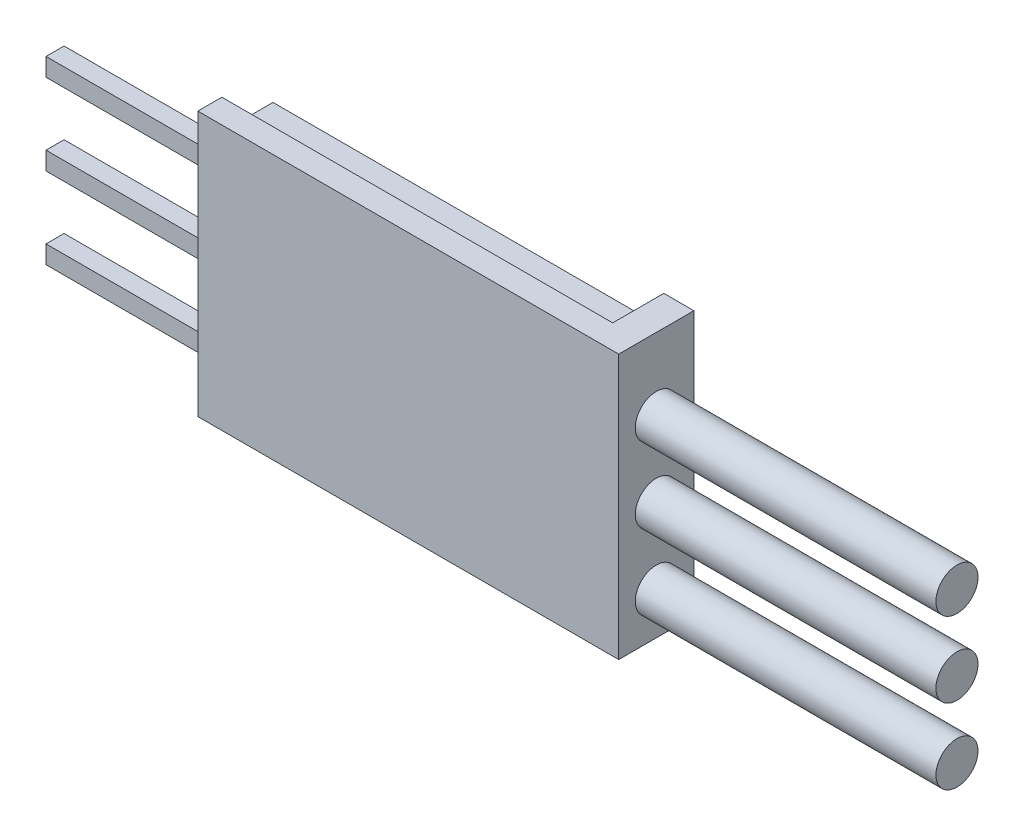
ISO-10303-21;
HEADER;
FILE_DESCRIPTION(('STEP AP214'),'2;1');
FILE_NAME('part.step','',(''),(''),'','','');
FILE_SCHEMA(('AUTOMOTIVE_DESIGN { 1 0 10303 214 1 1 1 1 }'));
ENDSEC;
DATA;
#1=APPLICATION_CONTEXT('core data for automotive mechanical design processes');
#2=APPLICATION_PROTOCOL_DEFINITION('international standard','automotive_design',2000,#1);
#3=PRODUCT_CONTEXT('',#1,'mechanical');
#4=PRODUCT('Part','Part','',(#3));
#5=PRODUCT_RELATED_PRODUCT_CATEGORY('part','',(#4));
#6=PRODUCT_DEFINITION_FORMATION('','',#4);
#7=PRODUCT_DEFINITION_CONTEXT('part definition',#1,'design');
#8=PRODUCT_DEFINITION('design','',#6,#7);
#9=PRODUCT_DEFINITION_SHAPE('','',#8);
#10=(LENGTH_UNIT() NAMED_UNIT(*) SI_UNIT(.MILLI.,.METRE.));
#11=(NAMED_UNIT(*) PLANE_ANGLE_UNIT() SI_UNIT($,.RADIAN.));
#12=(NAMED_UNIT(*) SI_UNIT($,.STERADIAN.) SOLID_ANGLE_UNIT());
#13=UNCERTAINTY_MEASURE_WITH_UNIT(LENGTH_MEASURE(1.E-05),#10,'distance_accuracy_value','');
#14=(GEOMETRIC_REPRESENTATION_CONTEXT(3) GLOBAL_UNCERTAINTY_ASSIGNED_CONTEXT((#13)) GLOBAL_UNIT_ASSIGNED_CONTEXT((#10,
#11,#12)) REPRESENTATION_CONTEXT('',''));
#15=CARTESIAN_POINT('',(0.,0.,0.));
#16=DIRECTION('',(0.,0.,1.));
#17=DIRECTION('',(1.,0.,0.));
#18=AXIS2_PLACEMENT_3D('',#15,#16,#17);
#19=CARTESIAN_POINT('',(-7.,-3.,-0.3));
#20=DIRECTION('',(0.,-1.,0.));
#21=DIRECTION('',(0.,0.,-1.));
#22=AXIS2_PLACEMENT_3D('',#19,#20,#21);
#23=PLANE('',#22);
#24=DIRECTION('',(1.,0.,0.));
#25=VECTOR('',#24,1.);
#26=CARTESIAN_POINT('',(-7.,-3.,0.3));
#27=LINE('',#26,#25);
#28=CARTESIAN_POINT('',(-13.,-3.,0.3));
#29=VERTEX_POINT('',#28);
#30=CARTESIAN_POINT('',(-7.,-3.,0.3));
#31=VERTEX_POINT('',#30);
#32=EDGE_CURVE('E151',#29,#31,#27,.T.);
#33=ORIENTED_EDGE('',*,*,#32,.F.);
#34=DIRECTION('',(0.,0.,-1.));
#35=VECTOR('',#34,1.);
#36=CARTESIAN_POINT('',(-13.,-3.,-0.3));
#37=LINE('',#36,#35);
#38=CARTESIAN_POINT('',(-13.,-3.,-0.3));
#39=VERTEX_POINT('',#38);
#40=EDGE_CURVE('E156',#29,#39,#37,.T.);
#41=ORIENTED_EDGE('',*,*,#40,.T.);
#42=DIRECTION('',(-1.,0.,0.));
#43=VECTOR('',#42,1.);
#44=CARTESIAN_POINT('',(-7.,-3.,-0.3));
#45=LINE('',#44,#43);
#46=CARTESIAN_POINT('',(-7.,-3.,-0.3));
#47=VERTEX_POINT('',#46);
#48=EDGE_CURVE('E154',#47,#39,#45,.T.);
#49=ORIENTED_EDGE('',*,*,#48,.F.);
#50=DIRECTION('',(0.,0.,-1.));
#51=VECTOR('',#50,1.);
#52=CARTESIAN_POINT('',(-7.,-3.,-0.3));
#53=LINE('',#52,#51);
#54=EDGE_CURVE('E146',#47,#31,#53,.F.);
#55=ORIENTED_EDGE('',*,*,#54,.T.);
#56=EDGE_LOOP('',(#33,#41,#49,#55));
#57=FACE_BOUND('',#56,.T.);
#58=ADVANCED_FACE('F17',(#57),#23,.T.);
#59=CARTESIAN_POINT('',(-7.,0.3,-0.3));
#60=DIRECTION('',(0.,0.,-1.));
#61=DIRECTION('',(-1.,0.,0.));
#62=AXIS2_PLACEMENT_3D('',#59,#60,#61);
#63=PLANE('',#62);
#64=DIRECTION('',(1.,0.,0.));
#65=VECTOR('',#64,1.);
#66=CARTESIAN_POINT('',(-7.,-0.3,-0.3));
#67=LINE('',#66,#65);
#68=CARTESIAN_POINT('',(-13.,-0.3,-0.3));
#69=VERTEX_POINT('',#68);
#70=CARTESIAN_POINT('',(-7.,-0.3,-0.3));
#71=VERTEX_POINT('',#70);
#72=EDGE_CURVE('E277',#69,#71,#67,.T.);
#73=ORIENTED_EDGE('',*,*,#72,.F.);
#74=DIRECTION('',(0.,1.,0.));
#75=VECTOR('',#74,1.);
#76=CARTESIAN_POINT('',(-13.,0.3,-0.3));
#77=LINE('',#76,#75);
#78=CARTESIAN_POINT('',(-13.,0.3,-0.3));
#79=VERTEX_POINT('',#78);
#80=EDGE_CURVE('E177',#69,#79,#77,.T.);
#81=ORIENTED_EDGE('',*,*,#80,.T.);
#82=DIRECTION('',(1.,0.,0.));
#83=VECTOR('',#82,1.);
#84=CARTESIAN_POINT('',(-7.,0.3,-0.3));
#85=LINE('',#84,#83);
#86=CARTESIAN_POINT('',(-7.,0.3,-0.3));
#87=VERTEX_POINT('',#86);
#88=EDGE_CURVE('E269',#87,#79,#85,.F.);
#89=ORIENTED_EDGE('',*,*,#88,.F.);
#90=DIRECTION('',(0.,1.,0.));
#91=VECTOR('',#90,1.);
#92=CARTESIAN_POINT('',(-7.,0.3,-0.3));
#93=LINE('',#92,#91);
#94=EDGE_CURVE('E179',#87,#71,#93,.F.);
#95=ORIENTED_EDGE('',*,*,#94,.T.);
#96=EDGE_LOOP('',(#73,#81,#89,#95));
#97=FACE_BOUND('',#96,.T.);
#98=ADVANCED_FACE('F560',(#97),#63,.T.);
#99=CARTESIAN_POINT('',(-7.,3.,-0.3));
#100=DIRECTION('',(0.,0.,-1.));
#101=DIRECTION('',(-1.,0.,0.));
#102=AXIS2_PLACEMENT_3D('',#99,#100,#101);
#103=PLANE('',#102);
#104=DIRECTION('',(1.,0.,0.));
#105=VECTOR('',#104,1.);
#106=CARTESIAN_POINT('',(-7.,2.4,-0.3));
#107=LINE('',#106,#105);
#108=CARTESIAN_POINT('',(-13.,2.4,-0.3));
#109=VERTEX_POINT('',#108);
#110=CARTESIAN_POINT('',(-7.,2.4,-0.3));
#111=VERTEX_POINT('',#110);
#112=EDGE_CURVE('E260',#109,#111,#107,.T.);
#113=ORIENTED_EDGE('',*,*,#112,.F.);
#114=DIRECTION('',(0.,1.,0.));
#115=VECTOR('',#114,1.);
#116=CARTESIAN_POINT('',(-13.,3.,-0.3));
#117=LINE('',#116,#115);
#118=CARTESIAN_POINT('',(-13.,3.,-0.3));
#119=VERTEX_POINT('',#118);
#120=EDGE_CURVE('E170',#109,#119,#117,.T.);
#121=ORIENTED_EDGE('',*,*,#120,.T.);
#122=DIRECTION('',(1.,0.,0.));
#123=VECTOR('',#122,1.);
#124=CARTESIAN_POINT('',(-7.,3.,-0.3));
#125=LINE('',#124,#123);
#126=CARTESIAN_POINT('',(-7.,3.,-0.3));
#127=VERTEX_POINT('',#126);
#128=EDGE_CURVE('E252',#127,#119,#125,.F.);
#129=ORIENTED_EDGE('',*,*,#128,.F.);
#130=DIRECTION('',(0.,1.,0.));
#131=VECTOR('',#130,1.);
#132=CARTESIAN_POINT('',(-7.,3.,-0.3));
#133=LINE('',#132,#131);
#134=EDGE_CURVE('E172',#127,#111,#133,.F.);
#135=ORIENTED_EDGE('',*,*,#134,.T.);
#136=EDGE_LOOP('',(#113,#121,#129,#135));
#137=FACE_BOUND('',#136,.T.);
#138=ADVANCED_FACE('F553',(#137),#103,.T.);
#139=CARTESIAN_POINT('',(-7.,-3.,0.3));
#140=DIRECTION('',(0.,0.,1.));
#141=DIRECTION('',(1.,0.,0.));
#142=AXIS2_PLACEMENT_3D('',#139,#140,#141);
#143=PLANE('',#142);
#144=DIRECTION('',(1.,0.,0.));
#145=VECTOR('',#144,1.);
#146=CARTESIAN_POINT('',(-7.,-2.4,0.3));
#147=LINE('',#146,#145);
#148=CARTESIAN_POINT('',(-13.,-2.4,0.3));
#149=VERTEX_POINT('',#148);
#150=CARTESIAN_POINT('',(-7.,-2.4,0.3));
#151=VERTEX_POINT('',#150);
#152=EDGE_CURVE('E232',#149,#151,#147,.T.);
#153=ORIENTED_EDGE('',*,*,#152,.F.);
#154=DIRECTION('',(0.,1.,0.));
#155=VECTOR('',#154,1.);
#156=CARTESIAN_POINT('',(-13.,0.,0.3));
#157=LINE('',#156,#155);
#158=EDGE_CURVE('E169',#29,#149,#157,.T.);
#159=ORIENTED_EDGE('',*,*,#158,.F.);
#160=ORIENTED_EDGE('',*,*,#32,.T.);
#161=DIRECTION('',(0.,1.,0.));
#162=VECTOR('',#161,1.);
#163=CARTESIAN_POINT('',(-7.,-3.,0.3));
#164=LINE('',#163,#162);
#165=EDGE_CURVE('E159',#31,#151,#164,.T.);
#166=ORIENTED_EDGE('',*,*,#165,.T.);
#167=EDGE_LOOP('',(#153,#159,#160,#166));
#168=FACE_BOUND('',#167,.T.);
#169=ADVANCED_FACE('F167',(#168),#143,.T.);
#170=CARTESIAN_POINT('',(-7.,-2.4,-0.3));
#171=DIRECTION('',(0.,0.,-1.));
#172=DIRECTION('',(-1.,0.,0.));
#173=AXIS2_PLACEMENT_3D('',#170,#171,#172);
#174=PLANE('',#173);
#175=ORIENTED_EDGE('',*,*,#48,.T.);
#176=DIRECTION('',(0.,1.,0.));
#177=VECTOR('',#176,1.);
#178=CARTESIAN_POINT('',(-13.,0.,-0.3));
#179=LINE('',#178,#177);
#180=CARTESIAN_POINT('',(-13.,-2.4,-0.3));
#181=VERTEX_POINT('',#180);
#182=EDGE_CURVE('E281',#181,#39,#179,.F.);
#183=ORIENTED_EDGE('',*,*,#182,.F.);
#184=DIRECTION('',(1.,0.,0.));
#185=VECTOR('',#184,1.);
#186=CARTESIAN_POINT('',(-7.,-2.4,-0.3));
#187=LINE('',#186,#185);
#188=CARTESIAN_POINT('',(-7.,-2.4,-0.3));
#189=VERTEX_POINT('',#188);
#190=EDGE_CURVE('E229',#189,#181,#187,.F.);
#191=ORIENTED_EDGE('',*,*,#190,.F.);
#192=DIRECTION('',(0.,1.,0.));
#193=VECTOR('',#192,1.);
#194=CARTESIAN_POINT('',(-7.,-2.4,-0.3));
#195=LINE('',#194,#193);
#196=EDGE_CURVE('E165',#189,#47,#195,.F.);
#197=ORIENTED_EDGE('',*,*,#196,.T.);
#198=EDGE_LOOP('',(#175,#183,#191,#197));
#199=FACE_BOUND('',#198,.T.);
#200=ADVANCED_FACE('F286',(#199),#174,.T.);
#201=CARTESIAN_POINT('',(-13.,0.,-1.25));
#202=DIRECTION('',(-1.,0.,0.));
#203=DIRECTION('',(0.,0.,1.));
#204=AXIS2_PLACEMENT_3D('',#201,#202,#203);
#205=PLANE('',#204);
#206=ORIENTED_EDGE('',*,*,#158,.T.);
#207=DIRECTION('',(0.,0.,1.));
#208=VECTOR('',#207,1.);
#209=CARTESIAN_POINT('',(-13.,-2.4,0.3));
#210=LINE('',#209,#208);
#211=EDGE_CURVE('E226',#181,#149,#210,.T.);
#212=ORIENTED_EDGE('',*,*,#211,.F.);
#213=ORIENTED_EDGE('',*,*,#182,.T.);
#214=ORIENTED_EDGE('',*,*,#40,.F.);
#215=EDGE_LOOP('',(#206,#212,#213,#214));
#216=FACE_BOUND('',#215,.T.);
#217=ADVANCED_FACE('F532',(#216),#205,.T.);
#218=CARTESIAN_POINT('',(-7.,-0.3,-0.3));
#219=DIRECTION('',(0.,-1.,0.));
#220=DIRECTION('',(0.,0.,-1.));
#221=AXIS2_PLACEMENT_3D('',#218,#219,#220);
#222=PLANE('',#221);
#223=DIRECTION('',(1.,0.,0.));
#224=VECTOR('',#223,1.);
#225=CARTESIAN_POINT('',(-7.,-0.3,0.3));
#226=LINE('',#225,#224);
#227=CARTESIAN_POINT('',(-13.,-0.3,0.3));
#228=VERTEX_POINT('',#227);
#229=CARTESIAN_POINT('',(-7.,-0.3,0.3));
#230=VERTEX_POINT('',#229);
#231=EDGE_CURVE('E223',#228,#230,#226,.T.);
#232=ORIENTED_EDGE('',*,*,#231,.F.);
#233=DIRECTION('',(0.,0.,1.));
#234=VECTOR('',#233,1.);
#235=CARTESIAN_POINT('',(-13.,-0.3,-1.25));
#236=LINE('',#235,#234);
#237=EDGE_CURVE('E263',#69,#228,#236,.T.);
#238=ORIENTED_EDGE('',*,*,#237,.F.);
#239=ORIENTED_EDGE('',*,*,#72,.T.);
#240=DIRECTION('',(0.,0.,-1.));
#241=VECTOR('',#240,1.);
#242=CARTESIAN_POINT('',(-7.,-0.3,-0.3));
#243=LINE('',#242,#241);
#244=EDGE_CURVE('E275',#71,#230,#243,.F.);
#245=ORIENTED_EDGE('',*,*,#244,.T.);
#246=EDGE_LOOP('',(#232,#238,#239,#245));
#247=FACE_BOUND('',#246,.T.);
#248=ADVANCED_FACE('F524',(#247),#222,.T.);
#249=CARTESIAN_POINT('',(-7.,0.3,0.3));
#250=DIRECTION('',(0.,1.,0.));
#251=DIRECTION('',(0.,0.,1.));
#252=AXIS2_PLACEMENT_3D('',#249,#250,#251);
#253=PLANE('',#252);
#254=ORIENTED_EDGE('',*,*,#88,.T.);
#255=DIRECTION('',(0.,0.,1.));
#256=VECTOR('',#255,1.);
#257=CARTESIAN_POINT('',(-13.,0.3,-1.25));
#258=LINE('',#257,#256);
#259=CARTESIAN_POINT('',(-13.,0.3,0.3));
#260=VERTEX_POINT('',#259);
#261=EDGE_CURVE('E266',#260,#79,#258,.F.);
#262=ORIENTED_EDGE('',*,*,#261,.F.);
#263=DIRECTION('',(1.,0.,0.));
#264=VECTOR('',#263,1.);
#265=CARTESIAN_POINT('',(-7.,0.3,0.3));
#266=LINE('',#265,#264);
#267=CARTESIAN_POINT('',(-7.,0.3,0.3));
#268=VERTEX_POINT('',#267);
#269=EDGE_CURVE('E220',#268,#260,#266,.F.);
#270=ORIENTED_EDGE('',*,*,#269,.F.);
#271=DIRECTION('',(0.,0.,1.));
#272=VECTOR('',#271,1.);
#273=CARTESIAN_POINT('',(-7.,0.3,0.3));
#274=LINE('',#273,#272);
#275=EDGE_CURVE('E272',#268,#87,#274,.F.);
#276=ORIENTED_EDGE('',*,*,#275,.T.);
#277=EDGE_LOOP('',(#254,#262,#270,#276));
#278=FACE_BOUND('',#277,.T.);
#279=ADVANCED_FACE('F516',(#278),#253,.T.);
#280=CARTESIAN_POINT('',(-13.,0.,-1.25));
#281=DIRECTION('',(-1.,0.,0.));
#282=DIRECTION('',(0.,0.,1.));
#283=AXIS2_PLACEMENT_3D('',#280,#281,#282);
#284=PLANE('',#283);
#285=ORIENTED_EDGE('',*,*,#237,.T.);
#286=DIRECTION('',(0.,1.,0.));
#287=VECTOR('',#286,1.);
#288=CARTESIAN_POINT('',(-13.,-0.3,0.3));
#289=LINE('',#288,#287);
#290=EDGE_CURVE('E217',#260,#228,#289,.F.);
#291=ORIENTED_EDGE('',*,*,#290,.F.);
#292=ORIENTED_EDGE('',*,*,#261,.T.);
#293=ORIENTED_EDGE('',*,*,#80,.F.);
#294=EDGE_LOOP('',(#285,#291,#292,#293));
#295=FACE_BOUND('',#294,.T.);
#296=ADVANCED_FACE('F508',(#295),#284,.T.);
#297=CARTESIAN_POINT('',(-7.,2.4,-0.3));
#298=DIRECTION('',(0.,-1.,0.));
#299=DIRECTION('',(0.,0.,-1.));
#300=AXIS2_PLACEMENT_3D('',#297,#298,#299);
#301=PLANE('',#300);
#302=DIRECTION('',(1.,0.,0.));
#303=VECTOR('',#302,1.);
#304=CARTESIAN_POINT('',(-7.,2.4,0.3));
#305=LINE('',#304,#303);
#306=CARTESIAN_POINT('',(-13.,2.4,0.3));
#307=VERTEX_POINT('',#306);
#308=CARTESIAN_POINT('',(-7.,2.4,0.3));
#309=VERTEX_POINT('',#308);
#310=EDGE_CURVE('E211',#307,#309,#305,.T.);
#311=ORIENTED_EDGE('',*,*,#310,.F.);
#312=DIRECTION('',(0.,0.,1.));
#313=VECTOR('',#312,1.);
#314=CARTESIAN_POINT('',(-13.,2.4,-1.25));
#315=LINE('',#314,#313);
#316=EDGE_CURVE('E246',#109,#307,#315,.T.);
#317=ORIENTED_EDGE('',*,*,#316,.F.);
#318=ORIENTED_EDGE('',*,*,#112,.T.);
#319=DIRECTION('',(0.,0.,-1.));
#320=VECTOR('',#319,1.);
#321=CARTESIAN_POINT('',(-7.,2.4,-0.3));
#322=LINE('',#321,#320);
#323=EDGE_CURVE('E258',#111,#309,#322,.F.);
#324=ORIENTED_EDGE('',*,*,#323,.T.);
#325=EDGE_LOOP('',(#311,#317,#318,#324));
#326=FACE_BOUND('',#325,.T.);
#327=ADVANCED_FACE('F500',(#326),#301,.T.);
#328=CARTESIAN_POINT('',(-7.,3.,0.3));
#329=DIRECTION('',(0.,1.,0.));
#330=DIRECTION('',(0.,0.,1.));
#331=AXIS2_PLACEMENT_3D('',#328,#329,#330);
#332=PLANE('',#331);
#333=ORIENTED_EDGE('',*,*,#128,.T.);
#334=DIRECTION('',(0.,0.,1.));
#335=VECTOR('',#334,1.);
#336=CARTESIAN_POINT('',(-13.,3.,-1.25));
#337=LINE('',#336,#335);
#338=CARTESIAN_POINT('',(-13.,3.,0.3));
#339=VERTEX_POINT('',#338);
#340=EDGE_CURVE('E249',#339,#119,#337,.F.);
#341=ORIENTED_EDGE('',*,*,#340,.F.);
#342=DIRECTION('',(1.,0.,0.));
#343=VECTOR('',#342,1.);
#344=CARTESIAN_POINT('',(-7.,3.,0.3));
#345=LINE('',#344,#343);
#346=CARTESIAN_POINT('',(-7.,3.,0.3));
#347=VERTEX_POINT('',#346);
#348=EDGE_CURVE('E205',#347,#339,#345,.F.);
#349=ORIENTED_EDGE('',*,*,#348,.F.);
#350=DIRECTION('',(0.,0.,1.));
#351=VECTOR('',#350,1.);
#352=CARTESIAN_POINT('',(-7.,3.,0.3));
#353=LINE('',#352,#351);
#354=EDGE_CURVE('E255',#347,#127,#353,.F.);
#355=ORIENTED_EDGE('',*,*,#354,.T.);
#356=EDGE_LOOP('',(#333,#341,#349,#355));
#357=FACE_BOUND('',#356,.T.);
#358=ADVANCED_FACE('F492',(#357),#332,.T.);
#359=CARTESIAN_POINT('',(-13.,0.,-1.25));
#360=DIRECTION('',(-1.,0.,0.));
#361=DIRECTION('',(0.,0.,1.));
#362=AXIS2_PLACEMENT_3D('',#359,#360,#361);
#363=PLANE('',#362);
#364=ORIENTED_EDGE('',*,*,#316,.T.);
#365=DIRECTION('',(0.,1.,0.));
#366=VECTOR('',#365,1.);
#367=CARTESIAN_POINT('',(-13.,2.4,0.3));
#368=LINE('',#367,#366);
#369=EDGE_CURVE('E201',#339,#307,#368,.F.);
#370=ORIENTED_EDGE('',*,*,#369,.F.);
#371=ORIENTED_EDGE('',*,*,#340,.T.);
#372=ORIENTED_EDGE('',*,*,#120,.F.);
#373=EDGE_LOOP('',(#364,#370,#371,#372));
#374=FACE_BOUND('',#373,.T.);
#375=ADVANCED_FACE('F484',(#374),#363,.T.);
#376=CARTESIAN_POINT('',(17.,0.,-1.25));
#377=DIRECTION('',(1.,0.,0.));
#378=DIRECTION('',(0.,0.,-1.));
#379=AXIS2_PLACEMENT_3D('',#376,#377,#378);
#380=PLANE('',#379);
#381=CARTESIAN_POINT('',(17.,2.5,0.));
#382=DIRECTION('',(1.,0.,0.));
#383=DIRECTION('',(0.,0.,-1.));
#384=AXIS2_PLACEMENT_3D('',#381,#382,#383);
#385=CIRCLE('',#384,0.7);
#386=CARTESIAN_POINT('',(17.,2.5,-0.7));
#387=VERTEX_POINT('',#386);
#388=EDGE_CURVE('E20',#387,#387,#385,.F.);
#389=ORIENTED_EDGE('',*,*,#388,.F.);
#390=EDGE_LOOP('',(#389));
#391=FACE_BOUND('',#390,.T.);
#392=ADVANCED_FACE('F476',(#391),#380,.T.);
#393=CARTESIAN_POINT('',(17.,0.,-1.25));
#394=DIRECTION('',(1.,0.,0.));
#395=DIRECTION('',(0.,0.,-1.));
#396=AXIS2_PLACEMENT_3D('',#393,#394,#395);
#397=PLANE('',#396);
#398=CARTESIAN_POINT('',(17.,0.,0.));
#399=DIRECTION('',(1.,0.,0.));
#400=DIRECTION('',(0.,0.,-1.));
#401=AXIS2_PLACEMENT_3D('',#398,#399,#400);
#402=CIRCLE('',#401,0.7);
#403=CARTESIAN_POINT('',(17.,0.,-0.7));
#404=VERTEX_POINT('',#403);
#405=EDGE_CURVE('E196',#404,#404,#402,.F.);
#406=ORIENTED_EDGE('',*,*,#405,.F.);
#407=EDGE_LOOP('',(#406));
#408=FACE_BOUND('',#407,.T.);
#409=ADVANCED_FACE('F368',(#408),#397,.T.);
#410=CARTESIAN_POINT('',(17.,0.,-1.25));
#411=DIRECTION('',(1.,0.,0.));
#412=DIRECTION('',(0.,0.,-1.));
#413=AXIS2_PLACEMENT_3D('',#410,#411,#412);
#414=PLANE('',#413);
#415=CARTESIAN_POINT('',(17.,-2.5,0.));
#416=DIRECTION('',(1.,0.,0.));
#417=DIRECTION('',(0.,0.,-1.));
#418=AXIS2_PLACEMENT_3D('',#415,#416,#417);
#419=CIRCLE('',#418,0.7);
#420=CARTESIAN_POINT('',(17.,-2.5,-0.7));
#421=VERTEX_POINT('',#420);
#422=EDGE_CURVE('E193',#421,#421,#419,.F.);
#423=ORIENTED_EDGE('',*,*,#422,.F.);
#424=EDGE_LOOP('',(#423));
#425=FACE_BOUND('',#424,.T.);
#426=ADVANCED_FACE('F360',(#425),#414,.T.);
#427=CARTESIAN_POINT('',(7.,3.9,-1.25));
#428=DIRECTION('',(0.,1.,0.));
#429=DIRECTION('',(0.,0.,1.));
#430=AXIS2_PLACEMENT_3D('',#427,#428,#429);
#431=PLANE('',#430);
#432=DIRECTION('',(1.,0.,0.));
#433=VECTOR('',#432,1.);
#434=CARTESIAN_POINT('',(0.,3.9,-1.25));
#435=LINE('',#434,#433);
#436=CARTESIAN_POINT('',(6.,3.9,-1.25));
#437=VERTEX_POINT('',#436);
#438=CARTESIAN_POINT('',(-7.,3.9,-1.25));
#439=VERTEX_POINT('',#438);
#440=EDGE_CURVE('E305',#437,#439,#435,.F.);
#441=ORIENTED_EDGE('',*,*,#440,.T.);
#442=DIRECTION('',(0.,0.,1.));
#443=VECTOR('',#442,1.);
#444=CARTESIAN_POINT('',(-7.,3.9,-1.25));
#445=LINE('',#444,#443);
#446=CARTESIAN_POINT('',(-7.,3.9,0.45));
#447=VERTEX_POINT('',#446);
#448=EDGE_CURVE('E244',#439,#447,#445,.T.);
#449=ORIENTED_EDGE('',*,*,#448,.T.);
#450=DIRECTION('',(-1.,0.,0.));
#451=VECTOR('',#450,1.);
#452=CARTESIAN_POINT('',(-7.,3.9,0.45));
#453=LINE('',#452,#451);
#454=CARTESIAN_POINT('',(6.,3.9,0.45));
#455=VERTEX_POINT('',#454);
#456=EDGE_CURVE('E236',#455,#447,#453,.T.);
#457=ORIENTED_EDGE('',*,*,#456,.F.);
#458=DIRECTION('',(0.,0.,-1.));
#459=VECTOR('',#458,1.);
#460=CARTESIAN_POINT('',(6.,3.9,-1.25));
#461=LINE('',#460,#459);
#462=EDGE_CURVE('E242',#455,#437,#461,.T.);
#463=ORIENTED_EDGE('',*,*,#462,.T.);
#464=EDGE_LOOP('',(#441,#449,#457,#463));
#465=FACE_BOUND('',#464,.T.);
#466=ADVANCED_FACE('F358',(#465),#431,.T.);
#467=CARTESIAN_POINT('',(6.,0.,-1.25));
#468=DIRECTION('',(1.,0.,0.));
#469=DIRECTION('',(0.,0.,-1.));
#470=AXIS2_PLACEMENT_3D('',#467,#468,#469);
#471=PLANE('',#470);
#472=DIRECTION('',(0.,1.,0.));
#473=VECTOR('',#472,1.);
#474=CARTESIAN_POINT('',(6.,0.,-1.25));
#475=LINE('',#474,#473);
#476=CARTESIAN_POINT('',(6.,4.9,-1.25));
#477=VERTEX_POINT('',#476);
#478=EDGE_CURVE('E195',#477,#437,#475,.F.);
#479=ORIENTED_EDGE('',*,*,#478,.T.);
#480=ORIENTED_EDGE('',*,*,#462,.F.);
#481=DIRECTION('',(0.,1.,0.));
#482=VECTOR('',#481,1.);
#483=CARTESIAN_POINT('',(6.,3.9,0.45));
#484=LINE('',#483,#482);
#485=CARTESIAN_POINT('',(6.,4.9,0.45));
#486=VERTEX_POINT('',#485);
#487=EDGE_CURVE('E239',#486,#455,#484,.F.);
#488=ORIENTED_EDGE('',*,*,#487,.F.);
#489=DIRECTION('',(0.,0.,1.));
#490=VECTOR('',#489,1.);
#491=CARTESIAN_POINT('',(6.,4.9,0.45));
#492=LINE('',#491,#490);
#493=EDGE_CURVE('E303',#477,#486,#492,.T.);
#494=ORIENTED_EDGE('',*,*,#493,.F.);
#495=EDGE_LOOP('',(#479,#480,#488,#494));
#496=FACE_BOUND('',#495,.T.);
#497=ADVANCED_FACE('F313',(#496),#471,.F.);
#498=CARTESIAN_POINT('',(-7.,3.9,0.45));
#499=DIRECTION('',(0.,0.,-1.));
#500=DIRECTION('',(-1.,0.,0.));
#501=AXIS2_PLACEMENT_3D('',#498,#499,#500);
#502=PLANE('',#501);
#503=ORIENTED_EDGE('',*,*,#456,.T.);
#504=DIRECTION('',(0.,1.,0.));
#505=VECTOR('',#504,1.);
#506=CARTESIAN_POINT('',(-7.,3.9,0.45));
#507=LINE('',#506,#505);
#508=CARTESIAN_POINT('',(-7.,4.9,0.45));
#509=VERTEX_POINT('',#508);
#510=EDGE_CURVE('E234',#447,#509,#507,.T.);
#511=ORIENTED_EDGE('',*,*,#510,.T.);
#512=DIRECTION('',(1.,0.,0.));
#513=VECTOR('',#512,1.);
#514=CARTESIAN_POINT('',(-7.,4.9,0.45));
#515=LINE('',#514,#513);
#516=EDGE_CURVE('E297',#486,#509,#515,.F.);
#517=ORIENTED_EDGE('',*,*,#516,.F.);
#518=ORIENTED_EDGE('',*,*,#487,.T.);
#519=EDGE_LOOP('',(#503,#511,#517,#518));
#520=FACE_BOUND('',#519,.T.);
#521=ADVANCED_FACE('F357',(#520),#502,.T.);
#522=CARTESIAN_POINT('',(-7.,-2.4,0.3));
#523=DIRECTION('',(0.,1.,0.));
#524=DIRECTION('',(0.,0.,1.));
#525=AXIS2_PLACEMENT_3D('',#522,#523,#524);
#526=PLANE('',#525);
#527=ORIENTED_EDGE('',*,*,#190,.T.);
#528=ORIENTED_EDGE('',*,*,#211,.T.);
#529=ORIENTED_EDGE('',*,*,#152,.T.);
#530=DIRECTION('',(0.,0.,1.));
#531=VECTOR('',#530,1.);
#532=CARTESIAN_POINT('',(-7.,-2.4,-1.25));
#533=LINE('',#532,#531);
#534=EDGE_CURVE('E162',#189,#151,#533,.T.);
#535=ORIENTED_EDGE('',*,*,#534,.F.);
#536=EDGE_LOOP('',(#527,#528,#529,#535));
#537=FACE_BOUND('',#536,.T.);
#538=ADVANCED_FACE('F289',(#537),#526,.T.);
#539=CARTESIAN_POINT('',(-7.,-0.3,0.3));
#540=DIRECTION('',(0.,0.,1.));
#541=DIRECTION('',(1.,0.,0.));
#542=AXIS2_PLACEMENT_3D('',#539,#540,#541);
#543=PLANE('',#542);
#544=ORIENTED_EDGE('',*,*,#269,.T.);
#545=ORIENTED_EDGE('',*,*,#290,.T.);
#546=ORIENTED_EDGE('',*,*,#231,.T.);
#547=DIRECTION('',(0.,1.,0.));
#548=VECTOR('',#547,1.);
#549=CARTESIAN_POINT('',(-7.,3.9,0.3));
#550=LINE('',#549,#548);
#551=EDGE_CURVE('E290',#268,#230,#550,.F.);
#552=ORIENTED_EDGE('',*,*,#551,.F.);
#553=EDGE_LOOP('',(#544,#545,#546,#552));
#554=FACE_BOUND('',#553,.T.);
#555=ADVANCED_FACE('F399',(#554),#543,.T.);
#556=CARTESIAN_POINT('',(-7.,2.4,0.3));
#557=DIRECTION('',(0.,0.,1.));
#558=DIRECTION('',(1.,0.,0.));
#559=AXIS2_PLACEMENT_3D('',#556,#557,#558);
#560=PLANE('',#559);
#561=ORIENTED_EDGE('',*,*,#348,.T.);
#562=ORIENTED_EDGE('',*,*,#369,.T.);
#563=ORIENTED_EDGE('',*,*,#310,.T.);
#564=DIRECTION('',(0.,1.,0.));
#565=VECTOR('',#564,1.);
#566=CARTESIAN_POINT('',(-7.,3.9,0.3));
#567=LINE('',#566,#565);
#568=EDGE_CURVE('E294',#347,#309,#567,.F.);
#569=ORIENTED_EDGE('',*,*,#568,.F.);
#570=EDGE_LOOP('',(#561,#562,#563,#569));
#571=FACE_BOUND('',#570,.T.);
#572=ADVANCED_FACE('F396',(#571),#560,.T.);
#573=CARTESIAN_POINT('',(7.,2.5,0.));
#574=DIRECTION('',(1.,0.,0.));
#575=DIRECTION('',(0.,0.,-1.));
#576=AXIS2_PLACEMENT_3D('',#573,#574,#575);
#577=CYLINDRICAL_SURFACE('',#576,0.7);
#578=ORIENTED_EDGE('',*,*,#388,.T.);
#579=EDGE_LOOP('',(#578));
#580=FACE_BOUND('',#579,.T.);
#581=CARTESIAN_POINT('',(7.,2.5,0.));
#582=DIRECTION('',(1.,0.,0.));
#583=DIRECTION('',(0.,0.,-1.));
#584=AXIS2_PLACEMENT_3D('',#581,#582,#583);
#585=CIRCLE('',#584,0.7);
#586=CARTESIAN_POINT('',(7.,2.5,-0.7));
#587=VERTEX_POINT('',#586);
#588=EDGE_CURVE('E189',#587,#587,#585,.F.);
#589=ORIENTED_EDGE('',*,*,#588,.F.);
#590=EDGE_LOOP('',(#589));
#591=FACE_BOUND('',#590,.T.);
#592=ADVANCED_FACE('F393',(#580,#591),#577,.T.);
#593=CARTESIAN_POINT('',(7.,0.,0.));
#594=DIRECTION('',(1.,0.,0.));
#595=DIRECTION('',(0.,0.,-1.));
#596=AXIS2_PLACEMENT_3D('',#593,#594,#595);
#597=CYLINDRICAL_SURFACE('',#596,0.7);
#598=ORIENTED_EDGE('',*,*,#405,.T.);
#599=EDGE_LOOP('',(#598));
#600=FACE_BOUND('',#599,.T.);
#601=CARTESIAN_POINT('',(7.,0.,0.));
#602=DIRECTION('',(1.,0.,0.));
#603=DIRECTION('',(0.,0.,-1.));
#604=AXIS2_PLACEMENT_3D('',#601,#602,#603);
#605=CIRCLE('',#604,0.7);
#606=CARTESIAN_POINT('',(7.,0.,-0.7));
#607=VERTEX_POINT('',#606);
#608=EDGE_CURVE('E186',#607,#607,#605,.F.);
#609=ORIENTED_EDGE('',*,*,#608,.F.);
#610=EDGE_LOOP('',(#609));
#611=FACE_BOUND('',#610,.T.);
#612=ADVANCED_FACE('F389',(#600,#611),#597,.T.);
#613=CARTESIAN_POINT('',(7.,-2.5,0.));
#614=DIRECTION('',(1.,0.,0.));
#615=DIRECTION('',(0.,0.,-1.));
#616=AXIS2_PLACEMENT_3D('',#613,#614,#615);
#617=CYLINDRICAL_SURFACE('',#616,0.7);
#618=ORIENTED_EDGE('',*,*,#422,.T.);
#619=EDGE_LOOP('',(#618));
#620=FACE_BOUND('',#619,.T.);
#621=CARTESIAN_POINT('',(7.,-2.5,0.));
#622=DIRECTION('',(1.,0.,0.));
#623=DIRECTION('',(0.,0.,-1.));
#624=AXIS2_PLACEMENT_3D('',#621,#622,#623);
#625=CIRCLE('',#624,0.7);
#626=CARTESIAN_POINT('',(7.,-2.5,-0.7));
#627=VERTEX_POINT('',#626);
#628=EDGE_CURVE('E182',#627,#627,#625,.F.);
#629=ORIENTED_EDGE('',*,*,#628,.F.);
#630=EDGE_LOOP('',(#629));
#631=FACE_BOUND('',#630,.T.);
#632=ADVANCED_FACE('F386',(#620,#631),#617,.T.);
#633=CARTESIAN_POINT('',(0.,0.,-1.25));
#634=DIRECTION('',(0.,0.,1.));
#635=DIRECTION('',(1.,0.,0.));
#636=AXIS2_PLACEMENT_3D('',#633,#634,#635);
#637=PLANE('',#636);
#638=ORIENTED_EDGE('',*,*,#440,.F.);
#639=ORIENTED_EDGE('',*,*,#478,.F.);
#640=DIRECTION('',(1.,0.,0.));
#641=VECTOR('',#640,1.);
#642=CARTESIAN_POINT('',(-7.,4.9,-1.25));
#643=LINE('',#642,#641);
#644=CARTESIAN_POINT('',(7.,4.9,-1.25));
#645=VERTEX_POINT('',#644);
#646=EDGE_CURVE('E291',#645,#477,#643,.F.);
#647=ORIENTED_EDGE('',*,*,#646,.F.);
#648=DIRECTION('',(0.,1.,0.));
#649=VECTOR('',#648,1.);
#650=CARTESIAN_POINT('',(7.,-3.9,-1.25));
#651=LINE('',#650,#649);
#652=CARTESIAN_POINT('',(7.,-3.9,-1.25));
#653=VERTEX_POINT('',#652);
#654=EDGE_CURVE('E185',#653,#645,#651,.T.);
#655=ORIENTED_EDGE('',*,*,#654,.F.);
#656=DIRECTION('',(1.,0.,0.));
#657=VECTOR('',#656,1.);
#658=CARTESIAN_POINT('',(-7.,-3.9,-1.25));
#659=LINE('',#658,#657);
#660=CARTESIAN_POINT('',(-7.,-3.9,-1.25));
#661=VERTEX_POINT('',#660);
#662=EDGE_CURVE('E192',#661,#653,#659,.T.);
#663=ORIENTED_EDGE('',*,*,#662,.F.);
#664=DIRECTION('',(0.,1.,0.));
#665=VECTOR('',#664,1.);
#666=CARTESIAN_POINT('',(-7.,3.9,-1.25));
#667=LINE('',#666,#665);
#668=EDGE_CURVE('E318',#439,#661,#667,.F.);
#669=ORIENTED_EDGE('',*,*,#668,.F.);
#670=EDGE_LOOP('',(#638,#639,#647,#655,#663,#669));
#671=FACE_BOUND('',#670,.T.);
#672=ADVANCED_FACE('F316',(#671),#637,.F.);
#673=CARTESIAN_POINT('',(-7.,4.9,0.45));
#674=DIRECTION('',(0.,1.,0.));
#675=DIRECTION('',(0.,0.,1.));
#676=AXIS2_PLACEMENT_3D('',#673,#674,#675);
#677=PLANE('',#676);
#678=DIRECTION('',(0.,0.,-1.));
#679=VECTOR('',#678,1.);
#680=CARTESIAN_POINT('',(7.,4.9,-1.25));
#681=LINE('',#680,#679);
#682=CARTESIAN_POINT('',(7.,4.9,1.25));
#683=VERTEX_POINT('',#682);
#684=EDGE_CURVE('E332',#645,#683,#681,.F.);
#685=ORIENTED_EDGE('',*,*,#684,.F.);
#686=ORIENTED_EDGE('',*,*,#646,.T.);
#687=ORIENTED_EDGE('',*,*,#493,.T.);
#688=ORIENTED_EDGE('',*,*,#516,.T.);
#689=DIRECTION('',(0.,0.,1.));
#690=VECTOR('',#689,1.);
#691=CARTESIAN_POINT('',(-7.,4.9,-1.25));
#692=LINE('',#691,#690);
#693=CARTESIAN_POINT('',(-7.,4.9,1.25));
#694=VERTEX_POINT('',#693);
#695=EDGE_CURVE('E321',#694,#509,#692,.F.);
#696=ORIENTED_EDGE('',*,*,#695,.F.);
#697=DIRECTION('',(1.,0.,0.));
#698=VECTOR('',#697,1.);
#699=CARTESIAN_POINT('',(0.,4.9,1.25));
#700=LINE('',#699,#698);
#701=EDGE_CURVE('E336',#683,#694,#700,.F.);
#702=ORIENTED_EDGE('',*,*,#701,.F.);
#703=EDGE_LOOP('',(#685,#686,#687,#688,#696,#702));
#704=FACE_BOUND('',#703,.T.);
#705=ADVANCED_FACE('F351',(#704),#677,.T.);
#706=CARTESIAN_POINT('',(-7.,3.9,-1.25));
#707=DIRECTION('',(-1.,0.,0.));
#708=DIRECTION('',(0.,0.,1.));
#709=AXIS2_PLACEMENT_3D('',#706,#707,#708);
#710=PLANE('',#709);
#711=DIRECTION('',(0.,1.,0.));
#712=VECTOR('',#711,1.);
#713=CARTESIAN_POINT('',(-7.,0.,1.25));
#714=LINE('',#713,#712);
#715=CARTESIAN_POINT('',(-7.,-3.9,1.25));
#716=VERTEX_POINT('',#715);
#717=EDGE_CURVE('E339',#694,#716,#714,.F.);
#718=ORIENTED_EDGE('',*,*,#717,.F.);
#719=ORIENTED_EDGE('',*,*,#695,.T.);
#720=ORIENTED_EDGE('',*,*,#510,.F.);
#721=ORIENTED_EDGE('',*,*,#448,.F.);
#722=ORIENTED_EDGE('',*,*,#668,.T.);
#723=DIRECTION('',(0.,0.,-1.));
#724=VECTOR('',#723,1.);
#725=CARTESIAN_POINT('',(-7.,-3.9,-1.25));
#726=LINE('',#725,#724);
#727=EDGE_CURVE('E324',#716,#661,#726,.T.);
#728=ORIENTED_EDGE('',*,*,#727,.F.);
#729=EDGE_LOOP('',(#718,#719,#720,#721,#722,#728));
#730=FACE_BOUND('',#729,.T.);
#731=ORIENTED_EDGE('',*,*,#354,.F.);
#732=ORIENTED_EDGE('',*,*,#568,.T.);
#733=ORIENTED_EDGE('',*,*,#323,.F.);
#734=ORIENTED_EDGE('',*,*,#134,.F.);
#735=EDGE_LOOP('',(#731,#732,#733,#734));
#736=FACE_BOUND('',#735,.T.);
#737=ORIENTED_EDGE('',*,*,#275,.F.);
#738=ORIENTED_EDGE('',*,*,#551,.T.);
#739=ORIENTED_EDGE('',*,*,#244,.F.);
#740=ORIENTED_EDGE('',*,*,#94,.F.);
#741=EDGE_LOOP('',(#737,#738,#739,#740));
#742=FACE_BOUND('',#741,.T.);
#743=ORIENTED_EDGE('',*,*,#196,.F.);
#744=ORIENTED_EDGE('',*,*,#534,.T.);
#745=ORIENTED_EDGE('',*,*,#165,.F.);
#746=ORIENTED_EDGE('',*,*,#54,.F.);
#747=EDGE_LOOP('',(#743,#744,#745,#746));
#748=FACE_BOUND('',#747,.T.);
#749=ADVANCED_FACE('F160',(#730,#736,#742,#748),#710,.T.);
#750=CARTESIAN_POINT('',(-7.,-3.9,-1.25));
#751=DIRECTION('',(0.,-1.,0.));
#752=DIRECTION('',(0.,0.,-1.));
#753=AXIS2_PLACEMENT_3D('',#750,#751,#752);
#754=PLANE('',#753);
#755=DIRECTION('',(0.,0.,-1.));
#756=VECTOR('',#755,1.);
#757=CARTESIAN_POINT('',(7.,-3.9,-1.25));
#758=LINE('',#757,#756);
#759=CARTESIAN_POINT('',(7.,-3.9,1.25));
#760=VERTEX_POINT('',#759);
#761=EDGE_CURVE('E35',#760,#653,#758,.T.);
#762=ORIENTED_EDGE('',*,*,#761,.F.);
#763=DIRECTION('',(1.,0.,0.));
#764=VECTOR('',#763,1.);
#765=CARTESIAN_POINT('',(0.,-3.9,1.25));
#766=LINE('',#765,#764);
#767=EDGE_CURVE('E26',#716,#760,#766,.T.);
#768=ORIENTED_EDGE('',*,*,#767,.F.);
#769=ORIENTED_EDGE('',*,*,#727,.T.);
#770=ORIENTED_EDGE('',*,*,#662,.T.);
#771=EDGE_LOOP('',(#762,#768,#769,#770));
#772=FACE_BOUND('',#771,.T.);
#773=ADVANCED_FACE('F346',(#772),#754,.T.);
#774=CARTESIAN_POINT('',(7.,-3.9,-1.25));
#775=DIRECTION('',(1.,0.,0.));
#776=DIRECTION('',(0.,0.,-1.));
#777=AXIS2_PLACEMENT_3D('',#774,#775,#776);
#778=PLANE('',#777);
#779=DIRECTION('',(0.,1.,0.));
#780=VECTOR('',#779,1.);
#781=CARTESIAN_POINT('',(7.,0.,1.25));
#782=LINE('',#781,#780);
#783=EDGE_CURVE('E11',#760,#683,#782,.T.);
#784=ORIENTED_EDGE('',*,*,#783,.F.);
#785=ORIENTED_EDGE('',*,*,#761,.T.);
#786=ORIENTED_EDGE('',*,*,#654,.T.);
#787=ORIENTED_EDGE('',*,*,#684,.T.);
#788=EDGE_LOOP('',(#784,#785,#786,#787));
#789=FACE_BOUND('',#788,.T.);
#790=ORIENTED_EDGE('',*,*,#628,.T.);
#791=EDGE_LOOP('',(#790));
#792=FACE_BOUND('',#791,.T.);
#793=ORIENTED_EDGE('',*,*,#608,.T.);
#794=EDGE_LOOP('',(#793));
#795=FACE_BOUND('',#794,.T.);
#796=ORIENTED_EDGE('',*,*,#588,.T.);
#797=EDGE_LOOP('',(#796));
#798=FACE_BOUND('',#797,.T.);
#799=ADVANCED_FACE('F353',(#789,#792,#795,#798),#778,.T.);
#800=CARTESIAN_POINT('',(0.,0.,1.25));
#801=DIRECTION('',(0.,0.,1.));
#802=DIRECTION('',(1.,0.,0.));
#803=AXIS2_PLACEMENT_3D('',#800,#801,#802);
#804=PLANE('',#803);
#805=ORIENTED_EDGE('',*,*,#767,.T.);
#806=ORIENTED_EDGE('',*,*,#783,.T.);
#807=ORIENTED_EDGE('',*,*,#701,.T.);
#808=ORIENTED_EDGE('',*,*,#717,.T.);
#809=EDGE_LOOP('',(#805,#806,#807,#808));
#810=FACE_BOUND('',#809,.T.);
#811=ADVANCED_FACE('F344',(#810),#804,.T.);
#812=CLOSED_SHELL('',(#58,#98,#138,#169,#200,#217,#248,#279,#296,#327,#358,#375,#392,#409,#426,
#466,#497,#521,#538,#555,#572,#592,#612,#632,#672,#705,#749,#773,#799,#811));
#813=MANIFOLD_SOLID_BREP('B1',#812);
#814=ADVANCED_BREP_SHAPE_REPRESENTATION('',(#18,#813),#14);
#815=SHAPE_DEFINITION_REPRESENTATION(#9,#814);
ENDSEC;
END-ISO-10303-21;
